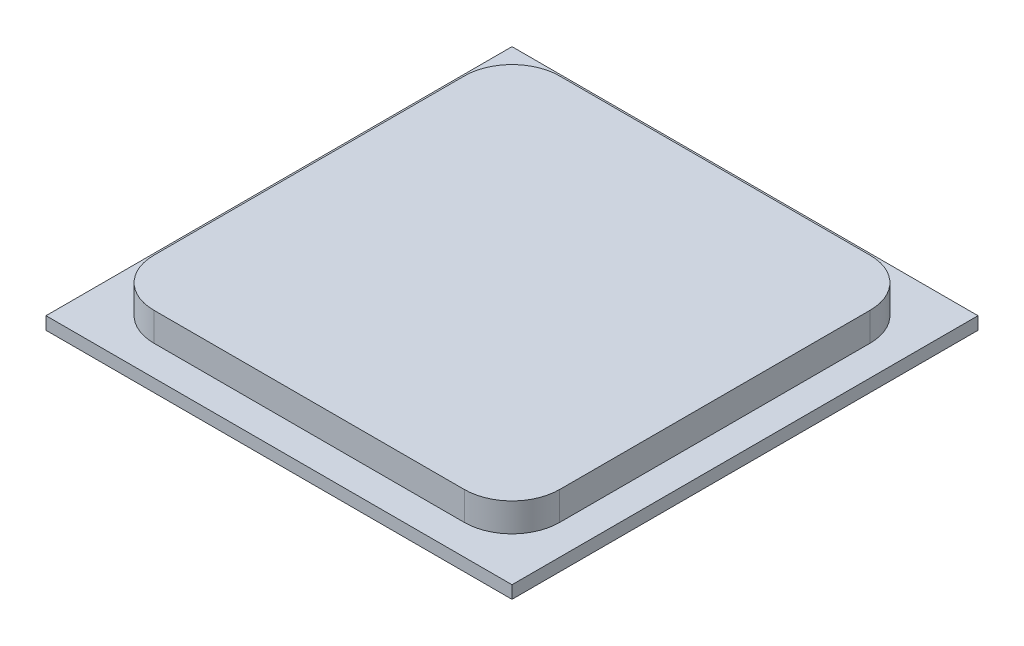
ISO-10303-21;
HEADER;
FILE_DESCRIPTION(('STEP AP214'),'2;1');
FILE_NAME('part.step','',(''),(''),'','','');
FILE_SCHEMA(('AUTOMOTIVE_DESIGN { 1 0 10303 214 1 1 1 1 }'));
ENDSEC;
DATA;
#1=APPLICATION_CONTEXT('core data for automotive mechanical design processes');
#2=APPLICATION_PROTOCOL_DEFINITION('international standard','automotive_design',2000,#1);
#3=PRODUCT_CONTEXT('',#1,'mechanical');
#4=PRODUCT('Part','Part','',(#3));
#5=PRODUCT_RELATED_PRODUCT_CATEGORY('part','',(#4));
#6=PRODUCT_DEFINITION_FORMATION('','',#4);
#7=PRODUCT_DEFINITION_CONTEXT('part definition',#1,'design');
#8=PRODUCT_DEFINITION('design','',#6,#7);
#9=PRODUCT_DEFINITION_SHAPE('','',#8);
#10=(LENGTH_UNIT() NAMED_UNIT(*) SI_UNIT(.MILLI.,.METRE.));
#11=(NAMED_UNIT(*) PLANE_ANGLE_UNIT() SI_UNIT($,.RADIAN.));
#12=(NAMED_UNIT(*) SI_UNIT($,.STERADIAN.) SOLID_ANGLE_UNIT());
#13=UNCERTAINTY_MEASURE_WITH_UNIT(LENGTH_MEASURE(1.E-05),#10,'distance_accuracy_value','');
#14=(GEOMETRIC_REPRESENTATION_CONTEXT(3) GLOBAL_UNCERTAINTY_ASSIGNED_CONTEXT((#13)) GLOBAL_UNIT_ASSIGNED_CONTEXT((#10,
#11,#12)) REPRESENTATION_CONTEXT('',''));
#15=CARTESIAN_POINT('',(0.,0.,0.));
#16=DIRECTION('',(0.,0.,1.));
#17=DIRECTION('',(1.,0.,0.));
#18=AXIS2_PLACEMENT_3D('',#15,#16,#17);
#19=CARTESIAN_POINT('',(-73.5,4.,73.5));
#20=DIRECTION('',(1.,0.,0.));
#21=DIRECTION('',(0.,0.,-1.));
#22=AXIS2_PLACEMENT_3D('',#19,#20,#21);
#23=PLANE('',#22);
#24=DIRECTION('',(0.,0.,1.));
#25=VECTOR('',#24,1.);
#26=CARTESIAN_POINT('',(-73.5,0.,73.5));
#27=LINE('',#26,#25);
#28=CARTESIAN_POINT('',(-73.5,0.,-73.5));
#29=VERTEX_POINT('',#28);
#30=CARTESIAN_POINT('',(-73.5,0.,73.5));
#31=VERTEX_POINT('',#30);
#32=EDGE_CURVE('E247',#29,#31,#27,.T.);
#33=ORIENTED_EDGE('',*,*,#32,.T.);
#34=DIRECTION('',(0.,-1.,0.));
#35=VECTOR('',#34,1.);
#36=CARTESIAN_POINT('',(-73.5,4.,73.5));
#37=LINE('',#36,#35);
#38=CARTESIAN_POINT('',(-73.5,4.,73.5));
#39=VERTEX_POINT('',#38);
#40=EDGE_CURVE('E11',#39,#31,#37,.T.);
#41=ORIENTED_EDGE('',*,*,#40,.F.);
#42=DIRECTION('',(0.,0.,1.));
#43=VECTOR('',#42,1.);
#44=CARTESIAN_POINT('',(-73.5,4.,73.5));
#45=LINE('',#44,#43);
#46=CARTESIAN_POINT('',(-73.5,4.,-73.5));
#47=VERTEX_POINT('',#46);
#48=EDGE_CURVE('E248',#47,#39,#45,.T.);
#49=ORIENTED_EDGE('',*,*,#48,.F.);
#50=DIRECTION('',(0.,-1.,0.));
#51=VECTOR('',#50,1.);
#52=CARTESIAN_POINT('',(-73.5,4.,-73.5));
#53=LINE('',#52,#51);
#54=EDGE_CURVE('E258',#47,#29,#53,.T.);
#55=ORIENTED_EDGE('',*,*,#54,.T.);
#56=EDGE_LOOP('',(#33,#41,#49,#55));
#57=FACE_BOUND('',#56,.T.);
#58=ADVANCED_FACE('F35',(#57),#23,.F.);
#59=CARTESIAN_POINT('',(73.5,4.,73.5));
#60=DIRECTION('',(0.,0.,-1.));
#61=DIRECTION('',(-1.,0.,0.));
#62=AXIS2_PLACEMENT_3D('',#59,#60,#61);
#63=PLANE('',#62);
#64=DIRECTION('',(1.,0.,0.));
#65=VECTOR('',#64,1.);
#66=CARTESIAN_POINT('',(73.5,0.,73.5));
#67=LINE('',#66,#65);
#68=CARTESIAN_POINT('',(73.5,0.,73.5));
#69=VERTEX_POINT('',#68);
#70=EDGE_CURVE('E261',#31,#69,#67,.T.);
#71=ORIENTED_EDGE('',*,*,#70,.T.);
#72=DIRECTION('',(0.,-1.,0.));
#73=VECTOR('',#72,1.);
#74=CARTESIAN_POINT('',(73.5,4.,73.5));
#75=LINE('',#74,#73);
#76=CARTESIAN_POINT('',(73.5,4.,73.5));
#77=VERTEX_POINT('',#76);
#78=EDGE_CURVE('E42',#77,#69,#75,.T.);
#79=ORIENTED_EDGE('',*,*,#78,.F.);
#80=DIRECTION('',(1.,0.,0.));
#81=VECTOR('',#80,1.);
#82=CARTESIAN_POINT('',(73.5,4.,73.5));
#83=LINE('',#82,#81);
#84=EDGE_CURVE('E251',#39,#77,#83,.T.);
#85=ORIENTED_EDGE('',*,*,#84,.F.);
#86=ORIENTED_EDGE('',*,*,#40,.T.);
#87=EDGE_LOOP('',(#71,#79,#85,#86));
#88=FACE_BOUND('',#87,.T.);
#89=ADVANCED_FACE('F291',(#88),#63,.F.);
#90=CARTESIAN_POINT('',(73.5,4.,73.5));
#91=DIRECTION('',(-1.,0.,0.));
#92=DIRECTION('',(0.,0.,1.));
#93=AXIS2_PLACEMENT_3D('',#90,#91,#92);
#94=PLANE('',#93);
#95=DIRECTION('',(0.,0.,-1.));
#96=VECTOR('',#95,1.);
#97=CARTESIAN_POINT('',(73.5,0.,73.5));
#98=LINE('',#97,#96);
#99=CARTESIAN_POINT('',(73.5,0.,-73.5));
#100=VERTEX_POINT('',#99);
#101=EDGE_CURVE('E263',#69,#100,#98,.T.);
#102=ORIENTED_EDGE('',*,*,#101,.T.);
#103=DIRECTION('',(0.,-1.,0.));
#104=VECTOR('',#103,1.);
#105=CARTESIAN_POINT('',(73.5,4.,-73.5));
#106=LINE('',#105,#104);
#107=CARTESIAN_POINT('',(73.5,4.,-73.5));
#108=VERTEX_POINT('',#107);
#109=EDGE_CURVE('E268',#108,#100,#106,.T.);
#110=ORIENTED_EDGE('',*,*,#109,.F.);
#111=DIRECTION('',(0.,0.,-1.));
#112=VECTOR('',#111,1.);
#113=CARTESIAN_POINT('',(73.5,4.,73.5));
#114=LINE('',#113,#112);
#115=EDGE_CURVE('E254',#77,#108,#114,.T.);
#116=ORIENTED_EDGE('',*,*,#115,.F.);
#117=ORIENTED_EDGE('',*,*,#78,.T.);
#118=EDGE_LOOP('',(#102,#110,#116,#117));
#119=FACE_BOUND('',#118,.T.);
#120=ADVANCED_FACE('F275',(#119),#94,.F.);
#121=CARTESIAN_POINT('',(73.5,4.,-73.5));
#122=DIRECTION('',(0.,0.,1.));
#123=DIRECTION('',(1.,0.,0.));
#124=AXIS2_PLACEMENT_3D('',#121,#122,#123);
#125=PLANE('',#124);
#126=DIRECTION('',(-1.,0.,0.));
#127=VECTOR('',#126,1.);
#128=CARTESIAN_POINT('',(73.5,0.,-73.5));
#129=LINE('',#128,#127);
#130=EDGE_CURVE('E252',#100,#29,#129,.T.);
#131=ORIENTED_EDGE('',*,*,#130,.T.);
#132=ORIENTED_EDGE('',*,*,#54,.F.);
#133=DIRECTION('',(-1.,0.,0.));
#134=VECTOR('',#133,1.);
#135=CARTESIAN_POINT('',(73.5,4.,-73.5));
#136=LINE('',#135,#134);
#137=EDGE_CURVE('E256',#108,#47,#136,.T.);
#138=ORIENTED_EDGE('',*,*,#137,.F.);
#139=ORIENTED_EDGE('',*,*,#109,.T.);
#140=EDGE_LOOP('',(#131,#132,#138,#139));
#141=FACE_BOUND('',#140,.T.);
#142=ADVANCED_FACE('F284',(#141),#125,.F.);
#143=CARTESIAN_POINT('',(0.,4.,0.));
#144=DIRECTION('',(0.,1.,0.));
#145=DIRECTION('',(0.,0.,1.));
#146=AXIS2_PLACEMENT_3D('',#143,#144,#145);
#147=PLANE('',#146);
#148=CARTESIAN_POINT('',(-49.,4.,49.));
#149=DIRECTION('',(0.,1.,0.));
#150=DIRECTION('',(0.,0.,-1.));
#151=AXIS2_PLACEMENT_3D('',#148,#149,#150);
#152=CIRCLE('',#151,15.);
#153=CARTESIAN_POINT('',(-64.,4.,49.));
#154=VERTEX_POINT('',#153);
#155=CARTESIAN_POINT('',(-49.,4.,64.));
#156=VERTEX_POINT('',#155);
#157=EDGE_CURVE('E57',#154,#156,#152,.T.);
#158=ORIENTED_EDGE('',*,*,#157,.F.);
#159=DIRECTION('',(0.,0.,1.));
#160=VECTOR('',#159,1.);
#161=CARTESIAN_POINT('',(-64.,4.,49.));
#162=LINE('',#161,#160);
#163=CARTESIAN_POINT('',(-64.,4.,-49.));
#164=VERTEX_POINT('',#163);
#165=EDGE_CURVE('E189',#164,#154,#162,.T.);
#166=ORIENTED_EDGE('',*,*,#165,.F.);
#167=CARTESIAN_POINT('',(-49.,4.,-49.));
#168=DIRECTION('',(0.,1.,0.));
#169=DIRECTION('',(0.,0.,1.));
#170=AXIS2_PLACEMENT_3D('',#167,#168,#169);
#171=CIRCLE('',#170,15.);
#172=CARTESIAN_POINT('',(-49.,4.,-64.));
#173=VERTEX_POINT('',#172);
#174=EDGE_CURVE('E220',#173,#164,#171,.T.);
#175=ORIENTED_EDGE('',*,*,#174,.F.);
#176=DIRECTION('',(-1.,0.,0.));
#177=VECTOR('',#176,1.);
#178=CARTESIAN_POINT('',(49.,4.,-64.));
#179=LINE('',#178,#177);
#180=CARTESIAN_POINT('',(49.,4.,-64.));
#181=VERTEX_POINT('',#180);
#182=EDGE_CURVE('E217',#181,#173,#179,.T.);
#183=ORIENTED_EDGE('',*,*,#182,.F.);
#184=CARTESIAN_POINT('',(49.,4.,-49.));
#185=DIRECTION('',(0.,1.,0.));
#186=DIRECTION('',(0.,0.,1.));
#187=AXIS2_PLACEMENT_3D('',#184,#185,#186);
#188=CIRCLE('',#187,15.);
#189=CARTESIAN_POINT('',(64.,4.,-49.));
#190=VERTEX_POINT('',#189);
#191=EDGE_CURVE('E214',#190,#181,#188,.T.);
#192=ORIENTED_EDGE('',*,*,#191,.F.);
#193=DIRECTION('',(0.,0.,-1.));
#194=VECTOR('',#193,1.);
#195=CARTESIAN_POINT('',(64.,4.,49.));
#196=LINE('',#195,#194);
#197=CARTESIAN_POINT('',(64.,4.,49.));
#198=VERTEX_POINT('',#197);
#199=EDGE_CURVE('E211',#198,#190,#196,.T.);
#200=ORIENTED_EDGE('',*,*,#199,.F.);
#201=CARTESIAN_POINT('',(49.,4.,49.));
#202=DIRECTION('',(0.,1.,0.));
#203=DIRECTION('',(0.,0.,1.));
#204=AXIS2_PLACEMENT_3D('',#201,#202,#203);
#205=CIRCLE('',#204,15.);
#206=CARTESIAN_POINT('',(49.,4.,64.));
#207=VERTEX_POINT('',#206);
#208=EDGE_CURVE('E208',#207,#198,#205,.T.);
#209=ORIENTED_EDGE('',*,*,#208,.F.);
#210=DIRECTION('',(1.,0.,0.));
#211=VECTOR('',#210,1.);
#212=CARTESIAN_POINT('',(49.,4.,64.));
#213=LINE('',#212,#211);
#214=EDGE_CURVE('E205',#156,#207,#213,.T.);
#215=ORIENTED_EDGE('',*,*,#214,.F.);
#216=EDGE_LOOP('',(#158,#166,#175,#183,#192,#200,#209,#215));
#217=FACE_BOUND('',#216,.T.);
#218=ORIENTED_EDGE('',*,*,#48,.T.);
#219=ORIENTED_EDGE('',*,*,#84,.T.);
#220=ORIENTED_EDGE('',*,*,#115,.T.);
#221=ORIENTED_EDGE('',*,*,#137,.T.);
#222=EDGE_LOOP('',(#218,#219,#220,#221));
#223=FACE_BOUND('',#222,.T.);
#224=ADVANCED_FACE('F290',(#217,#223),#147,.T.);
#225=CARTESIAN_POINT('',(0.,0.,0.));
#226=DIRECTION('',(0.,1.,0.));
#227=DIRECTION('',(0.,0.,1.));
#228=AXIS2_PLACEMENT_3D('',#225,#226,#227);
#229=PLANE('',#228);
#230=DIRECTION('',(1.,0.,0.));
#231=VECTOR('',#230,1.);
#232=CARTESIAN_POINT('',(51.5,0.,-51.5));
#233=LINE('',#232,#231);
#234=CARTESIAN_POINT('',(-51.5,0.,-51.5));
#235=VERTEX_POINT('',#234);
#236=CARTESIAN_POINT('',(51.5,0.,-51.5));
#237=VERTEX_POINT('',#236);
#238=EDGE_CURVE('E176',#235,#237,#233,.T.);
#239=ORIENTED_EDGE('',*,*,#238,.F.);
#240=DIRECTION('',(0.,0.,-1.));
#241=VECTOR('',#240,1.);
#242=CARTESIAN_POINT('',(-51.5,0.,-51.5));
#243=LINE('',#242,#241);
#244=CARTESIAN_POINT('',(-51.5,0.,51.5));
#245=VERTEX_POINT('',#244);
#246=EDGE_CURVE('E49',#245,#235,#243,.T.);
#247=ORIENTED_EDGE('',*,*,#246,.F.);
#248=DIRECTION('',(-1.,0.,0.));
#249=VECTOR('',#248,1.);
#250=CARTESIAN_POINT('',(51.5,0.,51.5));
#251=LINE('',#250,#249);
#252=CARTESIAN_POINT('',(51.5,0.,51.5));
#253=VERTEX_POINT('',#252);
#254=EDGE_CURVE('E167',#253,#245,#251,.T.);
#255=ORIENTED_EDGE('',*,*,#254,.F.);
#256=DIRECTION('',(0.,0.,1.));
#257=VECTOR('',#256,1.);
#258=CARTESIAN_POINT('',(51.5,0.,-51.5));
#259=LINE('',#258,#257);
#260=EDGE_CURVE('E170',#237,#253,#259,.T.);
#261=ORIENTED_EDGE('',*,*,#260,.F.);
#262=EDGE_LOOP('',(#239,#247,#255,#261));
#263=FACE_BOUND('',#262,.T.);
#264=ORIENTED_EDGE('',*,*,#32,.F.);
#265=ORIENTED_EDGE('',*,*,#130,.F.);
#266=ORIENTED_EDGE('',*,*,#101,.F.);
#267=ORIENTED_EDGE('',*,*,#70,.F.);
#268=EDGE_LOOP('',(#264,#265,#266,#267));
#269=FACE_BOUND('',#268,.T.);
#270=ADVANCED_FACE('F281',(#263,#269),#229,.F.);
#271=CARTESIAN_POINT('',(-49.,13.,49.));
#272=DIRECTION('',(0.,-1.,0.));
#273=DIRECTION('',(0.,0.,-1.));
#274=AXIS2_PLACEMENT_3D('',#271,#272,#273);
#275=CYLINDRICAL_SURFACE('',#274,15.);
#276=ORIENTED_EDGE('',*,*,#157,.T.);
#277=DIRECTION('',(0.,-1.,0.));
#278=VECTOR('',#277,1.);
#279=CARTESIAN_POINT('',(-49.,13.,64.));
#280=LINE('',#279,#278);
#281=CARTESIAN_POINT('',(-49.,13.,64.));
#282=VERTEX_POINT('',#281);
#283=EDGE_CURVE('E244',#282,#156,#280,.T.);
#284=ORIENTED_EDGE('',*,*,#283,.F.);
#285=CARTESIAN_POINT('',(-49.,13.,49.));
#286=DIRECTION('',(0.,1.,0.));
#287=DIRECTION('',(0.,0.,-1.));
#288=AXIS2_PLACEMENT_3D('',#285,#286,#287);
#289=CIRCLE('',#288,15.);
#290=CARTESIAN_POINT('',(-64.,13.,49.));
#291=VERTEX_POINT('',#290);
#292=EDGE_CURVE('E185',#291,#282,#289,.T.);
#293=ORIENTED_EDGE('',*,*,#292,.F.);
#294=DIRECTION('',(0.,-1.,0.));
#295=VECTOR('',#294,1.);
#296=CARTESIAN_POINT('',(-64.,13.,49.));
#297=LINE('',#296,#295);
#298=EDGE_CURVE('E203',#291,#154,#297,.T.);
#299=ORIENTED_EDGE('',*,*,#298,.T.);
#300=EDGE_LOOP('',(#276,#284,#293,#299));
#301=FACE_BOUND('',#300,.T.);
#302=ADVANCED_FACE('F303',(#301),#275,.T.);
#303=CARTESIAN_POINT('',(49.,13.,64.));
#304=DIRECTION('',(0.,0.,-1.));
#305=DIRECTION('',(-1.,0.,0.));
#306=AXIS2_PLACEMENT_3D('',#303,#304,#305);
#307=PLANE('',#306);
#308=ORIENTED_EDGE('',*,*,#214,.T.);
#309=DIRECTION('',(0.,-1.,0.));
#310=VECTOR('',#309,1.);
#311=CARTESIAN_POINT('',(49.,13.,64.));
#312=LINE('',#311,#310);
#313=CARTESIAN_POINT('',(49.,13.,64.));
#314=VERTEX_POINT('',#313);
#315=EDGE_CURVE('E241',#314,#207,#312,.T.);
#316=ORIENTED_EDGE('',*,*,#315,.F.);
#317=DIRECTION('',(1.,0.,0.));
#318=VECTOR('',#317,1.);
#319=CARTESIAN_POINT('',(49.,13.,64.));
#320=LINE('',#319,#318);
#321=EDGE_CURVE('E188',#282,#314,#320,.T.);
#322=ORIENTED_EDGE('',*,*,#321,.F.);
#323=ORIENTED_EDGE('',*,*,#283,.T.);
#324=EDGE_LOOP('',(#308,#316,#322,#323));
#325=FACE_BOUND('',#324,.T.);
#326=ADVANCED_FACE('F309',(#325),#307,.F.);
#327=CARTESIAN_POINT('',(49.,13.,49.));
#328=DIRECTION('',(0.,-1.,0.));
#329=DIRECTION('',(0.,0.,-1.));
#330=AXIS2_PLACEMENT_3D('',#327,#328,#329);
#331=CYLINDRICAL_SURFACE('',#330,15.);
#332=ORIENTED_EDGE('',*,*,#208,.T.);
#333=DIRECTION('',(0.,-1.,0.));
#334=VECTOR('',#333,1.);
#335=CARTESIAN_POINT('',(64.,13.,49.));
#336=LINE('',#335,#334);
#337=CARTESIAN_POINT('',(64.,13.,49.));
#338=VERTEX_POINT('',#337);
#339=EDGE_CURVE('E238',#338,#198,#336,.T.);
#340=ORIENTED_EDGE('',*,*,#339,.F.);
#341=CARTESIAN_POINT('',(49.,13.,49.));
#342=DIRECTION('',(0.,1.,0.));
#343=DIRECTION('',(0.,0.,1.));
#344=AXIS2_PLACEMENT_3D('',#341,#342,#343);
#345=CIRCLE('',#344,15.);
#346=EDGE_CURVE('E191',#314,#338,#345,.T.);
#347=ORIENTED_EDGE('',*,*,#346,.F.);
#348=ORIENTED_EDGE('',*,*,#315,.T.);
#349=EDGE_LOOP('',(#332,#340,#347,#348));
#350=FACE_BOUND('',#349,.T.);
#351=ADVANCED_FACE('F313',(#350),#331,.T.);
#352=CARTESIAN_POINT('',(64.,13.,49.));
#353=DIRECTION('',(-1.,0.,0.));
#354=DIRECTION('',(0.,0.,1.));
#355=AXIS2_PLACEMENT_3D('',#352,#353,#354);
#356=PLANE('',#355);
#357=ORIENTED_EDGE('',*,*,#199,.T.);
#358=DIRECTION('',(0.,-1.,0.));
#359=VECTOR('',#358,1.);
#360=CARTESIAN_POINT('',(64.,13.,-49.));
#361=LINE('',#360,#359);
#362=CARTESIAN_POINT('',(64.,13.,-49.));
#363=VERTEX_POINT('',#362);
#364=EDGE_CURVE('E235',#363,#190,#361,.T.);
#365=ORIENTED_EDGE('',*,*,#364,.F.);
#366=DIRECTION('',(0.,0.,-1.));
#367=VECTOR('',#366,1.);
#368=CARTESIAN_POINT('',(64.,13.,49.));
#369=LINE('',#368,#367);
#370=EDGE_CURVE('E193',#338,#363,#369,.T.);
#371=ORIENTED_EDGE('',*,*,#370,.F.);
#372=ORIENTED_EDGE('',*,*,#339,.T.);
#373=EDGE_LOOP('',(#357,#365,#371,#372));
#374=FACE_BOUND('',#373,.T.);
#375=ADVANCED_FACE('F317',(#374),#356,.F.);
#376=CARTESIAN_POINT('',(49.,13.,-49.));
#377=DIRECTION('',(0.,-1.,0.));
#378=DIRECTION('',(0.,0.,-1.));
#379=AXIS2_PLACEMENT_3D('',#376,#377,#378);
#380=CYLINDRICAL_SURFACE('',#379,15.);
#381=ORIENTED_EDGE('',*,*,#191,.T.);
#382=DIRECTION('',(0.,-1.,0.));
#383=VECTOR('',#382,1.);
#384=CARTESIAN_POINT('',(49.,13.,-64.));
#385=LINE('',#384,#383);
#386=CARTESIAN_POINT('',(49.,13.,-64.));
#387=VERTEX_POINT('',#386);
#388=EDGE_CURVE('E232',#387,#181,#385,.T.);
#389=ORIENTED_EDGE('',*,*,#388,.F.);
#390=CARTESIAN_POINT('',(49.,13.,-49.));
#391=DIRECTION('',(0.,1.,0.));
#392=DIRECTION('',(0.,0.,1.));
#393=AXIS2_PLACEMENT_3D('',#390,#391,#392);
#394=CIRCLE('',#393,15.);
#395=EDGE_CURVE('E195',#363,#387,#394,.T.);
#396=ORIENTED_EDGE('',*,*,#395,.F.);
#397=ORIENTED_EDGE('',*,*,#364,.T.);
#398=EDGE_LOOP('',(#381,#389,#396,#397));
#399=FACE_BOUND('',#398,.T.);
#400=ADVANCED_FACE('F321',(#399),#380,.T.);
#401=CARTESIAN_POINT('',(49.,13.,-64.));
#402=DIRECTION('',(0.,0.,1.));
#403=DIRECTION('',(1.,0.,0.));
#404=AXIS2_PLACEMENT_3D('',#401,#402,#403);
#405=PLANE('',#404);
#406=ORIENTED_EDGE('',*,*,#182,.T.);
#407=DIRECTION('',(0.,-1.,0.));
#408=VECTOR('',#407,1.);
#409=CARTESIAN_POINT('',(-49.,13.,-64.));
#410=LINE('',#409,#408);
#411=CARTESIAN_POINT('',(-49.,13.,-64.));
#412=VERTEX_POINT('',#411);
#413=EDGE_CURVE('E229',#412,#173,#410,.T.);
#414=ORIENTED_EDGE('',*,*,#413,.F.);
#415=DIRECTION('',(-1.,0.,0.));
#416=VECTOR('',#415,1.);
#417=CARTESIAN_POINT('',(49.,13.,-64.));
#418=LINE('',#417,#416);
#419=EDGE_CURVE('E197',#387,#412,#418,.T.);
#420=ORIENTED_EDGE('',*,*,#419,.F.);
#421=ORIENTED_EDGE('',*,*,#388,.T.);
#422=EDGE_LOOP('',(#406,#414,#420,#421));
#423=FACE_BOUND('',#422,.T.);
#424=ADVANCED_FACE('F325',(#423),#405,.F.);
#425=CARTESIAN_POINT('',(-49.,13.,-49.));
#426=DIRECTION('',(0.,-1.,0.));
#427=DIRECTION('',(0.,0.,-1.));
#428=AXIS2_PLACEMENT_3D('',#425,#426,#427);
#429=CYLINDRICAL_SURFACE('',#428,15.);
#430=ORIENTED_EDGE('',*,*,#174,.T.);
#431=DIRECTION('',(0.,-1.,0.));
#432=VECTOR('',#431,1.);
#433=CARTESIAN_POINT('',(-64.,13.,-49.));
#434=LINE('',#433,#432);
#435=CARTESIAN_POINT('',(-64.,13.,-49.));
#436=VERTEX_POINT('',#435);
#437=EDGE_CURVE('E226',#436,#164,#434,.T.);
#438=ORIENTED_EDGE('',*,*,#437,.F.);
#439=CARTESIAN_POINT('',(-49.,13.,-49.));
#440=DIRECTION('',(0.,1.,0.));
#441=DIRECTION('',(0.,0.,1.));
#442=AXIS2_PLACEMENT_3D('',#439,#440,#441);
#443=CIRCLE('',#442,15.);
#444=EDGE_CURVE('E199',#412,#436,#443,.T.);
#445=ORIENTED_EDGE('',*,*,#444,.F.);
#446=ORIENTED_EDGE('',*,*,#413,.T.);
#447=EDGE_LOOP('',(#430,#438,#445,#446));
#448=FACE_BOUND('',#447,.T.);
#449=ADVANCED_FACE('F329',(#448),#429,.T.);
#450=CARTESIAN_POINT('',(-64.,13.,49.));
#451=DIRECTION('',(1.,0.,0.));
#452=DIRECTION('',(0.,0.,-1.));
#453=AXIS2_PLACEMENT_3D('',#450,#451,#452);
#454=PLANE('',#453);
#455=ORIENTED_EDGE('',*,*,#165,.T.);
#456=ORIENTED_EDGE('',*,*,#298,.F.);
#457=DIRECTION('',(0.,0.,1.));
#458=VECTOR('',#457,1.);
#459=CARTESIAN_POINT('',(-64.,13.,49.));
#460=LINE('',#459,#458);
#461=EDGE_CURVE('E201',#436,#291,#460,.T.);
#462=ORIENTED_EDGE('',*,*,#461,.F.);
#463=ORIENTED_EDGE('',*,*,#437,.T.);
#464=EDGE_LOOP('',(#455,#456,#462,#463));
#465=FACE_BOUND('',#464,.T.);
#466=ADVANCED_FACE('F333',(#465),#454,.F.);
#467=CARTESIAN_POINT('',(-49.,13.,49.));
#468=DIRECTION('',(0.,-1.,0.));
#469=DIRECTION('',(0.,0.,-1.));
#470=AXIS2_PLACEMENT_3D('',#467,#468,#469);
#471=PLANE('',#470);
#472=ORIENTED_EDGE('',*,*,#292,.T.);
#473=ORIENTED_EDGE('',*,*,#321,.T.);
#474=ORIENTED_EDGE('',*,*,#346,.T.);
#475=ORIENTED_EDGE('',*,*,#370,.T.);
#476=ORIENTED_EDGE('',*,*,#395,.T.);
#477=ORIENTED_EDGE('',*,*,#419,.T.);
#478=ORIENTED_EDGE('',*,*,#444,.T.);
#479=ORIENTED_EDGE('',*,*,#461,.T.);
#480=EDGE_LOOP('',(#472,#473,#474,#475,#476,#477,#478,#479));
#481=FACE_BOUND('',#480,.T.);
#482=ADVANCED_FACE('F337',(#481),#471,.F.);
#483=CARTESIAN_POINT('',(-51.5,1.,-51.5));
#484=DIRECTION('',(-1.,0.,0.));
#485=DIRECTION('',(0.,0.,1.));
#486=AXIS2_PLACEMENT_3D('',#483,#484,#485);
#487=PLANE('',#486);
#488=ORIENTED_EDGE('',*,*,#246,.T.);
#489=DIRECTION('',(0.,-1.,0.));
#490=VECTOR('',#489,1.);
#491=CARTESIAN_POINT('',(-51.5,1.,-51.5));
#492=LINE('',#491,#490);
#493=CARTESIAN_POINT('',(-51.5,1.,-51.5));
#494=VERTEX_POINT('',#493);
#495=EDGE_CURVE('E145',#494,#235,#492,.T.);
#496=ORIENTED_EDGE('',*,*,#495,.F.);
#497=DIRECTION('',(0.,0.,-1.));
#498=VECTOR('',#497,1.);
#499=CARTESIAN_POINT('',(-51.5,1.,-51.5));
#500=LINE('',#499,#498);
#501=CARTESIAN_POINT('',(-51.5,1.,51.5));
#502=VERTEX_POINT('',#501);
#503=EDGE_CURVE('E149',#502,#494,#500,.T.);
#504=ORIENTED_EDGE('',*,*,#503,.F.);
#505=DIRECTION('',(0.,-1.,0.));
#506=VECTOR('',#505,1.);
#507=CARTESIAN_POINT('',(-51.5,1.,51.5));
#508=LINE('',#507,#506);
#509=EDGE_CURVE('E180',#502,#245,#508,.T.);
#510=ORIENTED_EDGE('',*,*,#509,.T.);
#511=EDGE_LOOP('',(#488,#496,#504,#510));
#512=FACE_BOUND('',#511,.T.);
#513=ADVANCED_FACE('F147',(#512),#487,.F.);
#514=CARTESIAN_POINT('',(51.5,1.,51.5));
#515=DIRECTION('',(0.,0.,1.));
#516=DIRECTION('',(1.,0.,0.));
#517=AXIS2_PLACEMENT_3D('',#514,#515,#516);
#518=PLANE('',#517);
#519=ORIENTED_EDGE('',*,*,#254,.T.);
#520=ORIENTED_EDGE('',*,*,#509,.F.);
#521=DIRECTION('',(-1.,0.,0.));
#522=VECTOR('',#521,1.);
#523=CARTESIAN_POINT('',(51.5,1.,51.5));
#524=LINE('',#523,#522);
#525=CARTESIAN_POINT('',(51.5,1.,51.5));
#526=VERTEX_POINT('',#525);
#527=EDGE_CURVE('E155',#526,#502,#524,.T.);
#528=ORIENTED_EDGE('',*,*,#527,.F.);
#529=DIRECTION('',(0.,-1.,0.));
#530=VECTOR('',#529,1.);
#531=CARTESIAN_POINT('',(51.5,1.,51.5));
#532=LINE('',#531,#530);
#533=EDGE_CURVE('E182',#526,#253,#532,.T.);
#534=ORIENTED_EDGE('',*,*,#533,.T.);
#535=EDGE_LOOP('',(#519,#520,#528,#534));
#536=FACE_BOUND('',#535,.T.);
#537=ADVANCED_FACE('F344',(#536),#518,.F.);
#538=CARTESIAN_POINT('',(51.5,1.,-51.5));
#539=DIRECTION('',(1.,0.,0.));
#540=DIRECTION('',(0.,0.,-1.));
#541=AXIS2_PLACEMENT_3D('',#538,#539,#540);
#542=PLANE('',#541);
#543=ORIENTED_EDGE('',*,*,#260,.T.);
#544=ORIENTED_EDGE('',*,*,#533,.F.);
#545=DIRECTION('',(0.,0.,1.));
#546=VECTOR('',#545,1.);
#547=CARTESIAN_POINT('',(51.5,1.,-51.5));
#548=LINE('',#547,#546);
#549=CARTESIAN_POINT('',(51.5,1.,-51.5));
#550=VERTEX_POINT('',#549);
#551=EDGE_CURVE('E163',#550,#526,#548,.T.);
#552=ORIENTED_EDGE('',*,*,#551,.F.);
#553=DIRECTION('',(0.,-1.,0.));
#554=VECTOR('',#553,1.);
#555=CARTESIAN_POINT('',(51.5,1.,-51.5));
#556=LINE('',#555,#554);
#557=EDGE_CURVE('E154',#550,#237,#556,.T.);
#558=ORIENTED_EDGE('',*,*,#557,.T.);
#559=EDGE_LOOP('',(#543,#544,#552,#558));
#560=FACE_BOUND('',#559,.T.);
#561=ADVANCED_FACE('F347',(#560),#542,.F.);
#562=CARTESIAN_POINT('',(51.5,1.,-51.5));
#563=DIRECTION('',(0.,0.,-1.));
#564=DIRECTION('',(-1.,0.,0.));
#565=AXIS2_PLACEMENT_3D('',#562,#563,#564);
#566=PLANE('',#565);
#567=ORIENTED_EDGE('',*,*,#238,.T.);
#568=ORIENTED_EDGE('',*,*,#557,.F.);
#569=DIRECTION('',(1.,0.,0.));
#570=VECTOR('',#569,1.);
#571=CARTESIAN_POINT('',(51.5,1.,-51.5));
#572=LINE('',#571,#570);
#573=EDGE_CURVE('E158',#494,#550,#572,.T.);
#574=ORIENTED_EDGE('',*,*,#573,.F.);
#575=ORIENTED_EDGE('',*,*,#495,.T.);
#576=EDGE_LOOP('',(#567,#568,#574,#575));
#577=FACE_BOUND('',#576,.T.);
#578=ADVANCED_FACE('F159',(#577),#566,.F.);
#579=CARTESIAN_POINT('',(0.,1.,0.));
#580=DIRECTION('',(0.,-1.,0.));
#581=DIRECTION('',(0.,0.,-1.));
#582=AXIS2_PLACEMENT_3D('',#579,#580,#581);
#583=PLANE('',#582);
#584=ORIENTED_EDGE('',*,*,#503,.T.);
#585=ORIENTED_EDGE('',*,*,#573,.T.);
#586=ORIENTED_EDGE('',*,*,#551,.T.);
#587=ORIENTED_EDGE('',*,*,#527,.T.);
#588=EDGE_LOOP('',(#584,#585,#586,#587));
#589=FACE_BOUND('',#588,.T.);
#590=ADVANCED_FACE('F165',(#589),#583,.T.);
#591=CLOSED_SHELL('',(#58,#89,#120,#142,#224,#270,#302,#326,#351,#375,#400,#424,#449,#466,#482,
#513,#537,#561,#578,#590));
#592=MANIFOLD_SOLID_BREP('B2',#591);
#593=ADVANCED_BREP_SHAPE_REPRESENTATION('',(#18,#592),#14);
#594=SHAPE_DEFINITION_REPRESENTATION(#9,#593);
ENDSEC;
END-ISO-10303-21;
